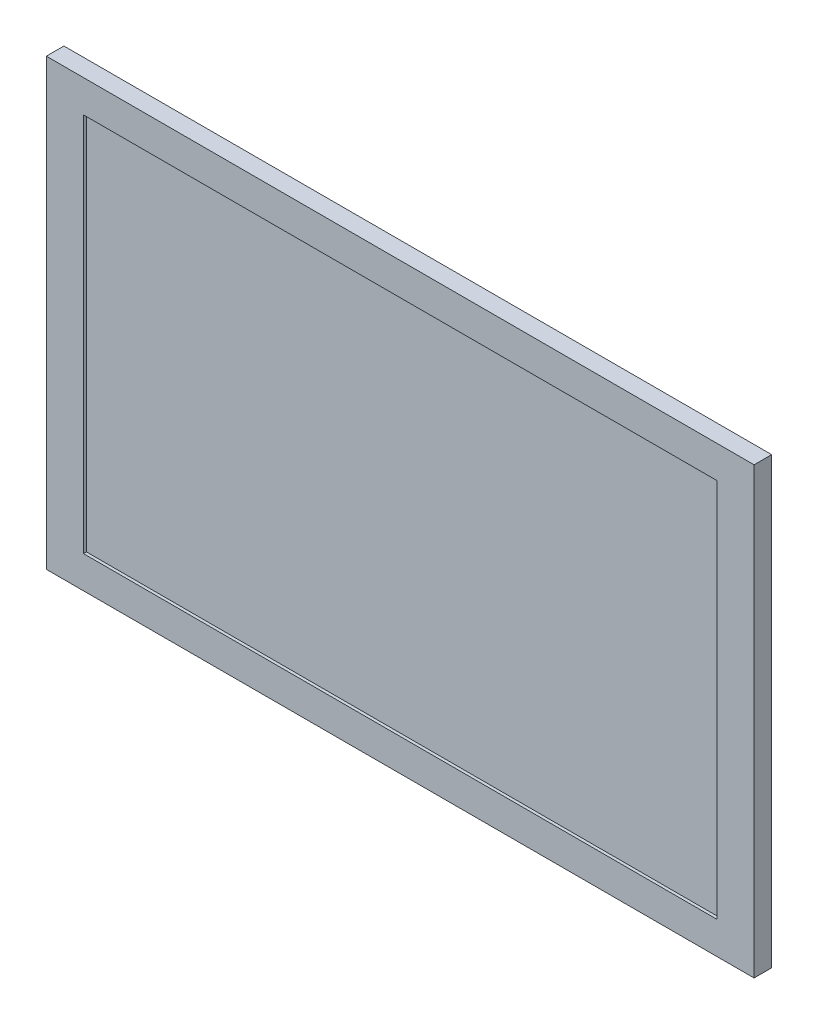
ISO-10303-21;
HEADER;
FILE_DESCRIPTION(('STEP AP214'),'2;1');
FILE_NAME('part.step','',(''),(''),'','','');
FILE_SCHEMA(('AUTOMOTIVE_DESIGN { 1 0 10303 214 1 1 1 1 }'));
ENDSEC;
DATA;
#1=APPLICATION_CONTEXT('core data for automotive mechanical design processes');
#2=APPLICATION_PROTOCOL_DEFINITION('international standard','automotive_design',2000,#1);
#3=PRODUCT_CONTEXT('',#1,'mechanical');
#4=PRODUCT('Part','Part','',(#3));
#5=PRODUCT_RELATED_PRODUCT_CATEGORY('part','',(#4));
#6=PRODUCT_DEFINITION_FORMATION('','',#4);
#7=PRODUCT_DEFINITION_CONTEXT('part definition',#1,'design');
#8=PRODUCT_DEFINITION('design','',#6,#7);
#9=PRODUCT_DEFINITION_SHAPE('','',#8);
#10=(LENGTH_UNIT() NAMED_UNIT(*) SI_UNIT(.MILLI.,.METRE.));
#11=(NAMED_UNIT(*) PLANE_ANGLE_UNIT() SI_UNIT($,.RADIAN.));
#12=(NAMED_UNIT(*) SI_UNIT($,.STERADIAN.) SOLID_ANGLE_UNIT());
#13=UNCERTAINTY_MEASURE_WITH_UNIT(LENGTH_MEASURE(1.E-05),#10,'distance_accuracy_value','');
#14=(GEOMETRIC_REPRESENTATION_CONTEXT(3) GLOBAL_UNCERTAINTY_ASSIGNED_CONTEXT((#13)) GLOBAL_UNIT_ASSIGNED_CONTEXT((#10,
#11,#12)) REPRESENTATION_CONTEXT('',''));
#15=CARTESIAN_POINT('',(0.,0.,0.));
#16=DIRECTION('',(0.,0.,1.));
#17=DIRECTION('',(1.,0.,0.));
#18=AXIS2_PLACEMENT_3D('',#15,#16,#17);
#19=CARTESIAN_POINT('',(60.35,37.9,1.5));
#20=DIRECTION('',(-1.,0.,0.));
#21=DIRECTION('',(0.,-1.,0.));
#22=AXIS2_PLACEMENT_3D('',#19,#20,#21);
#23=PLANE('',#22);
#24=DIRECTION('',(0.,1.,0.));
#25=VECTOR('',#24,1.);
#26=CARTESIAN_POINT('',(60.35,37.9,-1.5));
#27=LINE('',#26,#25);
#28=CARTESIAN_POINT('',(60.35,-37.9,-1.5));
#29=VERTEX_POINT('',#28);
#30=CARTESIAN_POINT('',(60.35,37.9,-1.5));
#31=VERTEX_POINT('',#30);
#32=EDGE_CURVE('E151',#29,#31,#27,.T.);
#33=ORIENTED_EDGE('',*,*,#32,.T.);
#34=DIRECTION('',(0.,0.,-1.));
#35=VECTOR('',#34,1.);
#36=CARTESIAN_POINT('',(60.35,37.9,1.5));
#37=LINE('',#36,#35);
#38=CARTESIAN_POINT('',(60.35,37.9,1.5));
#39=VERTEX_POINT('',#38);
#40=EDGE_CURVE('E11',#39,#31,#37,.T.);
#41=ORIENTED_EDGE('',*,*,#40,.F.);
#42=DIRECTION('',(0.,1.,0.));
#43=VECTOR('',#42,1.);
#44=CARTESIAN_POINT('',(60.35,37.9,1.5));
#45=LINE('',#44,#43);
#46=CARTESIAN_POINT('',(60.35,-37.9,1.5));
#47=VERTEX_POINT('',#46);
#48=EDGE_CURVE('E155',#47,#39,#45,.T.);
#49=ORIENTED_EDGE('',*,*,#48,.F.);
#50=DIRECTION('',(0.,0.,-1.));
#51=VECTOR('',#50,1.);
#52=CARTESIAN_POINT('',(60.35,-37.9,1.5));
#53=LINE('',#52,#51);
#54=EDGE_CURVE('E161',#47,#29,#53,.T.);
#55=ORIENTED_EDGE('',*,*,#54,.T.);
#56=EDGE_LOOP('',(#33,#41,#49,#55));
#57=FACE_BOUND('',#56,.T.);
#58=ADVANCED_FACE('F43',(#57),#23,.F.);
#59=CARTESIAN_POINT('',(-60.35,37.9,1.5));
#60=DIRECTION('',(0.,-1.,0.));
#61=DIRECTION('',(0.,0.,-1.));
#62=AXIS2_PLACEMENT_3D('',#59,#60,#61);
#63=PLANE('',#62);
#64=DIRECTION('',(-1.,0.,0.));
#65=VECTOR('',#64,1.);
#66=CARTESIAN_POINT('',(-60.35,37.9,-1.5));
#67=LINE('',#66,#65);
#68=CARTESIAN_POINT('',(-60.35,37.9,-1.5));
#69=VERTEX_POINT('',#68);
#70=EDGE_CURVE('E164',#31,#69,#67,.T.);
#71=ORIENTED_EDGE('',*,*,#70,.T.);
#72=DIRECTION('',(0.,0.,-1.));
#73=VECTOR('',#72,1.);
#74=CARTESIAN_POINT('',(-60.35,37.9,1.5));
#75=LINE('',#74,#73);
#76=CARTESIAN_POINT('',(-60.35,37.9,1.5));
#77=VERTEX_POINT('',#76);
#78=EDGE_CURVE('E50',#77,#69,#75,.T.);
#79=ORIENTED_EDGE('',*,*,#78,.F.);
#80=DIRECTION('',(-1.,0.,0.));
#81=VECTOR('',#80,1.);
#82=CARTESIAN_POINT('',(-60.35,37.9,1.5));
#83=LINE('',#82,#81);
#84=EDGE_CURVE('E94',#39,#77,#83,.T.);
#85=ORIENTED_EDGE('',*,*,#84,.F.);
#86=ORIENTED_EDGE('',*,*,#40,.T.);
#87=EDGE_LOOP('',(#71,#79,#85,#86));
#88=FACE_BOUND('',#87,.T.);
#89=ADVANCED_FACE('F194',(#88),#63,.F.);
#90=CARTESIAN_POINT('',(-60.35,37.9,1.5));
#91=DIRECTION('',(1.,0.,0.));
#92=DIRECTION('',(0.,1.,0.));
#93=AXIS2_PLACEMENT_3D('',#90,#91,#92);
#94=PLANE('',#93);
#95=DIRECTION('',(0.,-1.,0.));
#96=VECTOR('',#95,1.);
#97=CARTESIAN_POINT('',(-60.35,37.9,-1.5));
#98=LINE('',#97,#96);
#99=CARTESIAN_POINT('',(-60.35,-37.9,-1.5));
#100=VERTEX_POINT('',#99);
#101=EDGE_CURVE('E166',#69,#100,#98,.T.);
#102=ORIENTED_EDGE('',*,*,#101,.T.);
#103=DIRECTION('',(0.,0.,-1.));
#104=VECTOR('',#103,1.);
#105=CARTESIAN_POINT('',(-60.35,-37.9,1.5));
#106=LINE('',#105,#104);
#107=CARTESIAN_POINT('',(-60.35,-37.9,1.5));
#108=VERTEX_POINT('',#107);
#109=EDGE_CURVE('E170',#108,#100,#106,.T.);
#110=ORIENTED_EDGE('',*,*,#109,.F.);
#111=DIRECTION('',(0.,-1.,0.));
#112=VECTOR('',#111,1.);
#113=CARTESIAN_POINT('',(-60.35,37.9,1.5));
#114=LINE('',#113,#112);
#115=EDGE_CURVE('E158',#77,#108,#114,.T.);
#116=ORIENTED_EDGE('',*,*,#115,.F.);
#117=ORIENTED_EDGE('',*,*,#78,.T.);
#118=EDGE_LOOP('',(#102,#110,#116,#117));
#119=FACE_BOUND('',#118,.T.);
#120=ADVANCED_FACE('F175',(#119),#94,.F.);
#121=CARTESIAN_POINT('',(-60.35,-37.9,1.5));
#122=DIRECTION('',(0.,1.,0.));
#123=DIRECTION('',(0.,0.,1.));
#124=AXIS2_PLACEMENT_3D('',#121,#122,#123);
#125=PLANE('',#124);
#126=DIRECTION('',(1.,0.,0.));
#127=VECTOR('',#126,1.);
#128=CARTESIAN_POINT('',(-60.35,-37.9,-1.5));
#129=LINE('',#128,#127);
#130=EDGE_CURVE('E87',#100,#29,#129,.T.);
#131=ORIENTED_EDGE('',*,*,#130,.T.);
#132=ORIENTED_EDGE('',*,*,#54,.F.);
#133=DIRECTION('',(1.,0.,0.));
#134=VECTOR('',#133,1.);
#135=CARTESIAN_POINT('',(-60.35,-37.9,1.5));
#136=LINE('',#135,#134);
#137=EDGE_CURVE('E66',#108,#47,#136,.T.);
#138=ORIENTED_EDGE('',*,*,#137,.F.);
#139=ORIENTED_EDGE('',*,*,#109,.T.);
#140=EDGE_LOOP('',(#131,#132,#138,#139));
#141=FACE_BOUND('',#140,.T.);
#142=ADVANCED_FACE('F183',(#141),#125,.F.);
#143=CARTESIAN_POINT('',(0.,0.,1.5));
#144=DIRECTION('',(0.,0.,1.));
#145=DIRECTION('',(1.,0.,0.));
#146=AXIS2_PLACEMENT_3D('',#143,#144,#145);
#147=PLANE('',#146);
#148=DIRECTION('',(0.,1.,0.));
#149=VECTOR('',#148,1.);
#150=CARTESIAN_POINT('',(54.,32.4,1.5));
#151=LINE('',#150,#149);
#152=CARTESIAN_POINT('',(54.,-32.4,1.5));
#153=VERTEX_POINT('',#152);
#154=CARTESIAN_POINT('',(54.,32.4,1.5));
#155=VERTEX_POINT('',#154);
#156=EDGE_CURVE('E57',#153,#155,#151,.T.);
#157=ORIENTED_EDGE('',*,*,#156,.F.);
#158=DIRECTION('',(1.,0.,0.));
#159=VECTOR('',#158,1.);
#160=CARTESIAN_POINT('',(-54.,-32.4,1.5));
#161=LINE('',#160,#159);
#162=CARTESIAN_POINT('',(-54.,-32.4,1.5));
#163=VERTEX_POINT('',#162);
#164=EDGE_CURVE('E136',#163,#153,#161,.T.);
#165=ORIENTED_EDGE('',*,*,#164,.F.);
#166=DIRECTION('',(0.,-1.,0.));
#167=VECTOR('',#166,1.);
#168=CARTESIAN_POINT('',(-54.,32.4,1.5));
#169=LINE('',#168,#167);
#170=CARTESIAN_POINT('',(-54.,32.4,1.5));
#171=VERTEX_POINT('',#170);
#172=EDGE_CURVE('E139',#171,#163,#169,.T.);
#173=ORIENTED_EDGE('',*,*,#172,.F.);
#174=DIRECTION('',(-1.,0.,0.));
#175=VECTOR('',#174,1.);
#176=CARTESIAN_POINT('',(-54.,32.4,1.5));
#177=LINE('',#176,#175);
#178=EDGE_CURVE('E145',#155,#171,#177,.T.);
#179=ORIENTED_EDGE('',*,*,#178,.F.);
#180=EDGE_LOOP('',(#157,#165,#173,#179));
#181=FACE_BOUND('',#180,.T.);
#182=ORIENTED_EDGE('',*,*,#48,.T.);
#183=ORIENTED_EDGE('',*,*,#84,.T.);
#184=ORIENTED_EDGE('',*,*,#115,.T.);
#185=ORIENTED_EDGE('',*,*,#137,.T.);
#186=EDGE_LOOP('',(#182,#183,#184,#185));
#187=FACE_BOUND('',#186,.T.);
#188=ADVANCED_FACE('F185',(#181,#187),#147,.T.);
#189=CARTESIAN_POINT('',(0.,0.,-1.5));
#190=DIRECTION('',(0.,0.,1.));
#191=DIRECTION('',(1.,0.,0.));
#192=AXIS2_PLACEMENT_3D('',#189,#190,#191);
#193=PLANE('',#192);
#194=ORIENTED_EDGE('',*,*,#32,.F.);
#195=ORIENTED_EDGE('',*,*,#130,.F.);
#196=ORIENTED_EDGE('',*,*,#101,.F.);
#197=ORIENTED_EDGE('',*,*,#70,.F.);
#198=EDGE_LOOP('',(#194,#195,#196,#197));
#199=FACE_BOUND('',#198,.T.);
#200=ADVANCED_FACE('F179',(#199),#193,.F.);
#201=CARTESIAN_POINT('',(54.,32.4,1.));
#202=DIRECTION('',(1.,0.,0.));
#203=DIRECTION('',(0.,1.,0.));
#204=AXIS2_PLACEMENT_3D('',#201,#202,#203);
#205=PLANE('',#204);
#206=ORIENTED_EDGE('',*,*,#156,.T.);
#207=DIRECTION('',(0.,0.,1.));
#208=VECTOR('',#207,1.);
#209=CARTESIAN_POINT('',(54.,32.4,1.));
#210=LINE('',#209,#208);
#211=CARTESIAN_POINT('',(54.,32.4,1.));
#212=VERTEX_POINT('',#211);
#213=EDGE_CURVE('E114',#212,#155,#210,.T.);
#214=ORIENTED_EDGE('',*,*,#213,.F.);
#215=DIRECTION('',(0.,1.,0.));
#216=VECTOR('',#215,1.);
#217=CARTESIAN_POINT('',(54.,32.4,1.));
#218=LINE('',#217,#216);
#219=CARTESIAN_POINT('',(54.,-32.4,1.));
#220=VERTEX_POINT('',#219);
#221=EDGE_CURVE('E118',#220,#212,#218,.T.);
#222=ORIENTED_EDGE('',*,*,#221,.F.);
#223=DIRECTION('',(0.,0.,1.));
#224=VECTOR('',#223,1.);
#225=CARTESIAN_POINT('',(54.,-32.4,1.));
#226=LINE('',#225,#224);
#227=EDGE_CURVE('E149',#220,#153,#226,.T.);
#228=ORIENTED_EDGE('',*,*,#227,.T.);
#229=EDGE_LOOP('',(#206,#214,#222,#228));
#230=FACE_BOUND('',#229,.T.);
#231=ADVANCED_FACE('F116',(#230),#205,.F.);
#232=CARTESIAN_POINT('',(-54.,-32.4,1.));
#233=DIRECTION('',(0.,-1.,0.));
#234=DIRECTION('',(0.,0.,-1.));
#235=AXIS2_PLACEMENT_3D('',#232,#233,#234);
#236=PLANE('',#235);
#237=ORIENTED_EDGE('',*,*,#164,.T.);
#238=ORIENTED_EDGE('',*,*,#227,.F.);
#239=DIRECTION('',(1.,0.,0.));
#240=VECTOR('',#239,1.);
#241=CARTESIAN_POINT('',(-54.,-32.4,1.));
#242=LINE('',#241,#240);
#243=CARTESIAN_POINT('',(-54.,-32.4,1.));
#244=VERTEX_POINT('',#243);
#245=EDGE_CURVE('E124',#244,#220,#242,.T.);
#246=ORIENTED_EDGE('',*,*,#245,.F.);
#247=DIRECTION('',(0.,0.,1.));
#248=VECTOR('',#247,1.);
#249=CARTESIAN_POINT('',(-54.,-32.4,1.));
#250=LINE('',#249,#248);
#251=EDGE_CURVE('E152',#244,#163,#250,.T.);
#252=ORIENTED_EDGE('',*,*,#251,.T.);
#253=EDGE_LOOP('',(#237,#238,#246,#252));
#254=FACE_BOUND('',#253,.T.);
#255=ADVANCED_FACE('F234',(#254),#236,.F.);
#256=CARTESIAN_POINT('',(-54.,32.4,1.));
#257=DIRECTION('',(-1.,0.,0.));
#258=DIRECTION('',(0.,-1.,0.));
#259=AXIS2_PLACEMENT_3D('',#256,#257,#258);
#260=PLANE('',#259);
#261=ORIENTED_EDGE('',*,*,#172,.T.);
#262=ORIENTED_EDGE('',*,*,#251,.F.);
#263=DIRECTION('',(0.,-1.,0.));
#264=VECTOR('',#263,1.);
#265=CARTESIAN_POINT('',(-54.,32.4,1.));
#266=LINE('',#265,#264);
#267=CARTESIAN_POINT('',(-54.,32.4,1.));
#268=VERTEX_POINT('',#267);
#269=EDGE_CURVE('E132',#268,#244,#266,.T.);
#270=ORIENTED_EDGE('',*,*,#269,.F.);
#271=DIRECTION('',(0.,0.,1.));
#272=VECTOR('',#271,1.);
#273=CARTESIAN_POINT('',(-54.,32.4,1.));
#274=LINE('',#273,#272);
#275=EDGE_CURVE('E123',#268,#171,#274,.T.);
#276=ORIENTED_EDGE('',*,*,#275,.T.);
#277=EDGE_LOOP('',(#261,#262,#270,#276));
#278=FACE_BOUND('',#277,.T.);
#279=ADVANCED_FACE('F243',(#278),#260,.F.);
#280=CARTESIAN_POINT('',(-54.,32.4,1.));
#281=DIRECTION('',(0.,1.,0.));
#282=DIRECTION('',(0.,0.,1.));
#283=AXIS2_PLACEMENT_3D('',#280,#281,#282);
#284=PLANE('',#283);
#285=ORIENTED_EDGE('',*,*,#178,.T.);
#286=ORIENTED_EDGE('',*,*,#275,.F.);
#287=DIRECTION('',(-1.,0.,0.));
#288=VECTOR('',#287,1.);
#289=CARTESIAN_POINT('',(-54.,32.4,1.));
#290=LINE('',#289,#288);
#291=EDGE_CURVE('E127',#212,#268,#290,.T.);
#292=ORIENTED_EDGE('',*,*,#291,.F.);
#293=ORIENTED_EDGE('',*,*,#213,.T.);
#294=EDGE_LOOP('',(#285,#286,#292,#293));
#295=FACE_BOUND('',#294,.T.);
#296=ADVANCED_FACE('F128',(#295),#284,.F.);
#297=CARTESIAN_POINT('',(0.,0.,1.));
#298=DIRECTION('',(0.,0.,1.));
#299=DIRECTION('',(1.,0.,0.));
#300=AXIS2_PLACEMENT_3D('',#297,#298,#299);
#301=PLANE('',#300);
#302=ORIENTED_EDGE('',*,*,#221,.T.);
#303=ORIENTED_EDGE('',*,*,#291,.T.);
#304=ORIENTED_EDGE('',*,*,#269,.T.);
#305=ORIENTED_EDGE('',*,*,#245,.T.);
#306=EDGE_LOOP('',(#302,#303,#304,#305));
#307=FACE_BOUND('',#306,.T.);
#308=ADVANCED_FACE('F134',(#307),#301,.T.);
#309=CLOSED_SHELL('',(#58,#89,#120,#142,#188,#200,#231,#255,#279,#296,#308));
#310=MANIFOLD_SOLID_BREP('B2',#309);
#311=ADVANCED_BREP_SHAPE_REPRESENTATION('',(#18,#310),#14);
#312=SHAPE_DEFINITION_REPRESENTATION(#9,#311);
ENDSEC;
END-ISO-10303-21;
